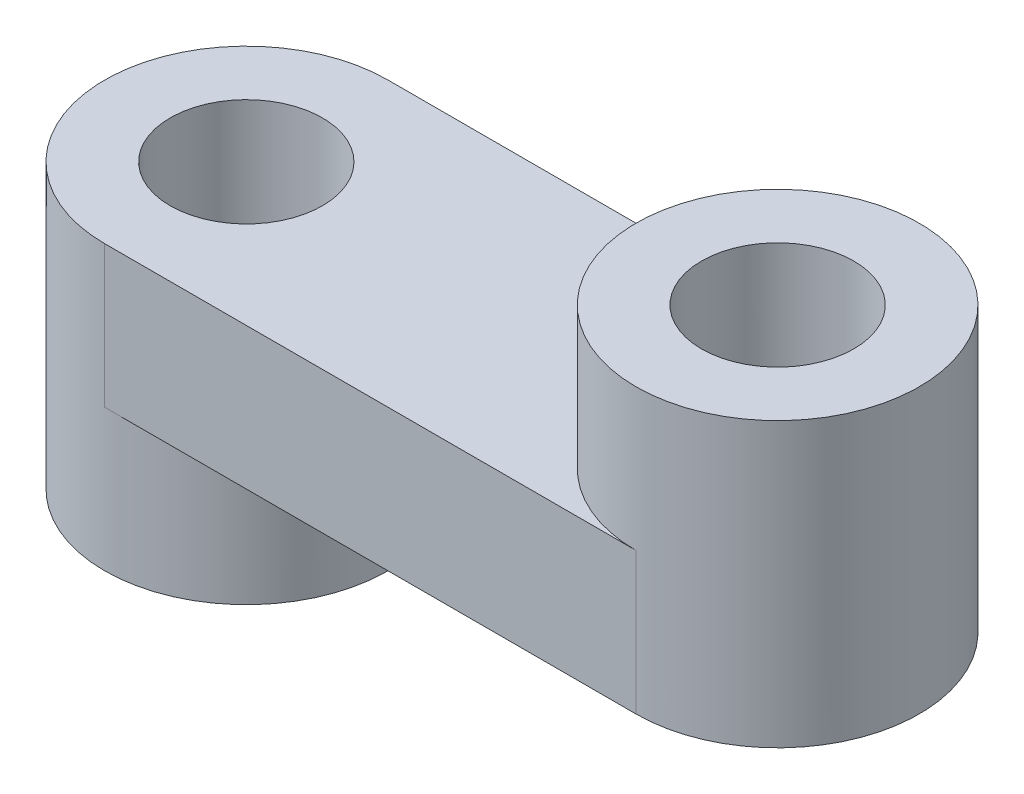
ISO-10303-21;
HEADER;
FILE_DESCRIPTION(('STEP AP214'),'2;1');
FILE_NAME('part.step','',(''),(''),'','','');
FILE_SCHEMA(('AUTOMOTIVE_DESIGN { 1 0 10303 214 1 1 1 1 }'));
ENDSEC;
DATA;
#1=APPLICATION_CONTEXT('core data for automotive mechanical design processes');
#2=APPLICATION_PROTOCOL_DEFINITION('international standard','automotive_design',2000,#1);
#3=PRODUCT_CONTEXT('',#1,'mechanical');
#4=PRODUCT('Part','Part','',(#3));
#5=PRODUCT_RELATED_PRODUCT_CATEGORY('part','',(#4));
#6=PRODUCT_DEFINITION_FORMATION('','',#4);
#7=PRODUCT_DEFINITION_CONTEXT('part definition',#1,'design');
#8=PRODUCT_DEFINITION('design','',#6,#7);
#9=PRODUCT_DEFINITION_SHAPE('','',#8);
#10=(LENGTH_UNIT() NAMED_UNIT(*) SI_UNIT(.MILLI.,.METRE.));
#11=(NAMED_UNIT(*) PLANE_ANGLE_UNIT() SI_UNIT($,.RADIAN.));
#12=(NAMED_UNIT(*) SI_UNIT($,.STERADIAN.) SOLID_ANGLE_UNIT());
#13=UNCERTAINTY_MEASURE_WITH_UNIT(LENGTH_MEASURE(1.E-05),#10,'distance_accuracy_value','');
#14=(GEOMETRIC_REPRESENTATION_CONTEXT(3) GLOBAL_UNCERTAINTY_ASSIGNED_CONTEXT((#13)) GLOBAL_UNIT_ASSIGNED_CONTEXT((#10,
#11,#12)) REPRESENTATION_CONTEXT('',''));
#15=CARTESIAN_POINT('',(0.,0.,0.));
#16=DIRECTION('',(0.,0.,1.));
#17=DIRECTION('',(1.,0.,0.));
#18=AXIS2_PLACEMENT_3D('',#15,#16,#17);
#19=CARTESIAN_POINT('',(0.,6.,2.));
#20=DIRECTION('',(0.,0.,-1.));
#21=DIRECTION('',(-1.,0.,0.));
#22=AXIS2_PLACEMENT_3D('',#19,#20,#21);
#23=PLANE('',#22);
#24=DIRECTION('',(-1.,0.,0.));
#25=VECTOR('',#24,1.);
#26=CARTESIAN_POINT('',(7.5,2.,2.));
#27=LINE('',#26,#25);
#28=CARTESIAN_POINT('',(7.5,2.,2.));
#29=VERTEX_POINT('',#28);
#30=CARTESIAN_POINT('',(0.,2.,2.));
#31=VERTEX_POINT('',#30);
#32=EDGE_CURVE('E88',#29,#31,#27,.T.);
#33=ORIENTED_EDGE('',*,*,#32,.F.);
#34=DIRECTION('',(0.,-1.,0.));
#35=VECTOR('',#34,1.);
#36=CARTESIAN_POINT('',(7.5,6.,2.));
#37=LINE('',#36,#35);
#38=CARTESIAN_POINT('',(7.5,4.,2.));
#39=VERTEX_POINT('',#38);
#40=EDGE_CURVE('E53',#39,#29,#37,.T.);
#41=ORIENTED_EDGE('',*,*,#40,.F.);
#42=DIRECTION('',(-1.,0.,0.));
#43=VECTOR('',#42,1.);
#44=CARTESIAN_POINT('',(7.5,4.,2.));
#45=LINE('',#44,#43);
#46=CARTESIAN_POINT('',(0.,4.,2.));
#47=VERTEX_POINT('',#46);
#48=EDGE_CURVE('E122',#39,#47,#45,.T.);
#49=ORIENTED_EDGE('',*,*,#48,.T.);
#50=DIRECTION('',(0.,-1.,0.));
#51=VECTOR('',#50,1.);
#52=CARTESIAN_POINT('',(0.,6.,2.));
#53=LINE('',#52,#51);
#54=EDGE_CURVE('E11',#47,#31,#53,.T.);
#55=ORIENTED_EDGE('',*,*,#54,.T.);
#56=EDGE_LOOP('',(#33,#41,#49,#55));
#57=FACE_BOUND('',#56,.T.);
#58=ADVANCED_FACE('F43',(#57),#23,.F.);
#59=CARTESIAN_POINT('',(0.,6.,-2.));
#60=DIRECTION('',(0.,0.,1.));
#61=DIRECTION('',(1.,0.,0.));
#62=AXIS2_PLACEMENT_3D('',#59,#60,#61);
#63=PLANE('',#62);
#64=DIRECTION('',(1.,0.,0.));
#65=VECTOR('',#64,1.);
#66=CARTESIAN_POINT('',(0.,2.,-2.));
#67=LINE('',#66,#65);
#68=CARTESIAN_POINT('',(0.,2.,-2.));
#69=VERTEX_POINT('',#68);
#70=CARTESIAN_POINT('',(7.5,2.,-2.));
#71=VERTEX_POINT('',#70);
#72=EDGE_CURVE('E61',#69,#71,#67,.T.);
#73=ORIENTED_EDGE('',*,*,#72,.F.);
#74=DIRECTION('',(0.,-1.,0.));
#75=VECTOR('',#74,1.);
#76=CARTESIAN_POINT('',(0.,6.,-2.));
#77=LINE('',#76,#75);
#78=CARTESIAN_POINT('',(0.,4.,-2.));
#79=VERTEX_POINT('',#78);
#80=EDGE_CURVE('E107',#79,#69,#77,.T.);
#81=ORIENTED_EDGE('',*,*,#80,.F.);
#82=DIRECTION('',(1.,0.,0.));
#83=VECTOR('',#82,1.);
#84=CARTESIAN_POINT('',(0.,4.,-2.));
#85=LINE('',#84,#83);
#86=CARTESIAN_POINT('',(7.5,4.,-2.));
#87=VERTEX_POINT('',#86);
#88=EDGE_CURVE('E145',#79,#87,#85,.T.);
#89=ORIENTED_EDGE('',*,*,#88,.T.);
#90=DIRECTION('',(0.,-1.,0.));
#91=VECTOR('',#90,1.);
#92=CARTESIAN_POINT('',(7.5,6.,-2.));
#93=LINE('',#92,#91);
#94=EDGE_CURVE('E104',#87,#71,#93,.T.);
#95=ORIENTED_EDGE('',*,*,#94,.T.);
#96=EDGE_LOOP('',(#73,#81,#89,#95));
#97=FACE_BOUND('',#96,.T.);
#98=ADVANCED_FACE('F144',(#97),#63,.F.);
#99=CARTESIAN_POINT('',(7.5,6.,0.));
#100=DIRECTION('',(0.,-1.,0.));
#101=DIRECTION('',(0.,0.,-1.));
#102=AXIS2_PLACEMENT_3D('',#99,#100,#101);
#103=CYLINDRICAL_SURFACE('',#102,2.);
#104=CARTESIAN_POINT('',(7.5,6.,0.));
#105=DIRECTION('',(0.,1.,0.));
#106=DIRECTION('',(0.,0.,1.));
#107=AXIS2_PLACEMENT_3D('',#104,#105,#106);
#108=CIRCLE('',#107,2.);
#109=CARTESIAN_POINT('',(7.5,6.,2.));
#110=VERTEX_POINT('',#109);
#111=EDGE_CURVE('E133',#110,#110,#108,.T.);
#112=ORIENTED_EDGE('',*,*,#111,.F.);
#113=EDGE_LOOP('',(#112));
#114=FACE_BOUND('',#113,.T.);
#115=CARTESIAN_POINT('',(7.5,2.,0.));
#116=DIRECTION('',(0.,-1.,0.));
#117=DIRECTION('',(0.,0.,-1.));
#118=AXIS2_PLACEMENT_3D('',#115,#116,#117);
#119=CIRCLE('',#118,2.);
#120=EDGE_CURVE('E85',#71,#29,#119,.T.);
#121=ORIENTED_EDGE('',*,*,#120,.F.);
#122=ORIENTED_EDGE('',*,*,#94,.F.);
#123=CARTESIAN_POINT('',(7.5,4.,0.));
#124=DIRECTION('',(0.,1.,0.));
#125=DIRECTION('',(0.,0.,1.));
#126=AXIS2_PLACEMENT_3D('',#123,#124,#125);
#127=CIRCLE('',#126,2.);
#128=EDGE_CURVE('E69',#87,#39,#127,.T.);
#129=ORIENTED_EDGE('',*,*,#128,.T.);
#130=ORIENTED_EDGE('',*,*,#40,.T.);
#131=EDGE_LOOP('',(#121,#122,#129,#130));
#132=FACE_BOUND('',#131,.T.);
#133=ADVANCED_FACE('F102',(#114,#132),#103,.T.);
#134=CARTESIAN_POINT('',(7.5,6.,0.));
#135=DIRECTION('',(0.,-1.,0.));
#136=DIRECTION('',(0.,0.,-1.));
#137=AXIS2_PLACEMENT_3D('',#134,#135,#136);
#138=CYLINDRICAL_SURFACE('',#137,1.075);
#139=CARTESIAN_POINT('',(7.5,6.,0.));
#140=DIRECTION('',(0.,1.,0.));
#141=DIRECTION('',(0.,0.,1.));
#142=AXIS2_PLACEMENT_3D('',#139,#140,#141);
#143=CIRCLE('',#142,1.075);
#144=CARTESIAN_POINT('',(7.5,6.,1.075));
#145=VERTEX_POINT('',#144);
#146=EDGE_CURVE('E113',#145,#145,#143,.T.);
#147=ORIENTED_EDGE('',*,*,#146,.T.);
#148=EDGE_LOOP('',(#147));
#149=FACE_BOUND('',#148,.T.);
#150=CARTESIAN_POINT('',(7.5,2.,0.));
#151=DIRECTION('',(0.,-1.,0.));
#152=DIRECTION('',(0.,0.,-1.));
#153=AXIS2_PLACEMENT_3D('',#150,#151,#152);
#154=CIRCLE('',#153,1.075);
#155=CARTESIAN_POINT('',(7.5,2.,-1.075));
#156=VERTEX_POINT('',#155);
#157=EDGE_CURVE('E47',#156,#156,#154,.T.);
#158=ORIENTED_EDGE('',*,*,#157,.T.);
#159=EDGE_LOOP('',(#158));
#160=FACE_BOUND('',#159,.T.);
#161=ADVANCED_FACE('F157',(#149,#160),#138,.F.);
#162=CARTESIAN_POINT('',(0.,6.,0.));
#163=DIRECTION('',(0.,1.,0.));
#164=DIRECTION('',(0.,0.,1.));
#165=AXIS2_PLACEMENT_3D('',#162,#163,#164);
#166=PLANE('',#165);
#167=ORIENTED_EDGE('',*,*,#146,.F.);
#168=EDGE_LOOP('',(#167));
#169=FACE_BOUND('',#168,.T.);
#170=ORIENTED_EDGE('',*,*,#111,.T.);
#171=EDGE_LOOP('',(#170));
#172=FACE_BOUND('',#171,.T.);
#173=ADVANCED_FACE('F181',(#169,#172),#166,.T.);
#174=CARTESIAN_POINT('',(0.,6.,0.));
#175=DIRECTION('',(0.,-1.,0.));
#176=DIRECTION('',(0.,0.,-1.));
#177=AXIS2_PLACEMENT_3D('',#174,#175,#176);
#178=CYLINDRICAL_SURFACE('',#177,2.);
#179=CARTESIAN_POINT('',(0.,0.,0.));
#180=DIRECTION('',(0.,1.,0.));
#181=DIRECTION('',(0.,0.,1.));
#182=AXIS2_PLACEMENT_3D('',#179,#180,#181);
#183=CIRCLE('',#182,2.);
#184=CARTESIAN_POINT('',(0.,0.,2.));
#185=VERTEX_POINT('',#184);
#186=EDGE_CURVE('E132',#185,#185,#183,.T.);
#187=ORIENTED_EDGE('',*,*,#186,.T.);
#188=EDGE_LOOP('',(#187));
#189=FACE_BOUND('',#188,.T.);
#190=CARTESIAN_POINT('',(0.,4.,0.));
#191=DIRECTION('',(0.,1.,0.));
#192=DIRECTION('',(0.,0.,1.));
#193=AXIS2_PLACEMENT_3D('',#190,#191,#192);
#194=CIRCLE('',#193,2.);
#195=EDGE_CURVE('E114',#79,#47,#194,.T.);
#196=ORIENTED_EDGE('',*,*,#195,.F.);
#197=ORIENTED_EDGE('',*,*,#80,.T.);
#198=CARTESIAN_POINT('',(0.,2.,0.));
#199=DIRECTION('',(0.,1.,0.));
#200=DIRECTION('',(0.,0.,1.));
#201=AXIS2_PLACEMENT_3D('',#198,#199,#200);
#202=CIRCLE('',#201,2.);
#203=EDGE_CURVE('E100',#31,#69,#202,.T.);
#204=ORIENTED_EDGE('',*,*,#203,.F.);
#205=ORIENTED_EDGE('',*,*,#54,.F.);
#206=EDGE_LOOP('',(#196,#197,#204,#205));
#207=FACE_BOUND('',#206,.T.);
#208=ADVANCED_FACE('F45',(#189,#207),#178,.T.);
#209=CARTESIAN_POINT('',(0.,6.,0.));
#210=DIRECTION('',(0.,-1.,0.));
#211=DIRECTION('',(0.,0.,-1.));
#212=AXIS2_PLACEMENT_3D('',#209,#210,#211);
#213=CYLINDRICAL_SURFACE('',#212,1.075);
#214=CARTESIAN_POINT('',(0.,0.,0.));
#215=DIRECTION('',(0.,1.,0.));
#216=DIRECTION('',(0.,0.,1.));
#217=AXIS2_PLACEMENT_3D('',#214,#215,#216);
#218=CIRCLE('',#217,1.075);
#219=CARTESIAN_POINT('',(0.,0.,1.075));
#220=VERTEX_POINT('',#219);
#221=EDGE_CURVE('E120',#220,#220,#218,.T.);
#222=ORIENTED_EDGE('',*,*,#221,.F.);
#223=EDGE_LOOP('',(#222));
#224=FACE_BOUND('',#223,.T.);
#225=CARTESIAN_POINT('',(0.,4.,0.));
#226=DIRECTION('',(0.,1.,0.));
#227=DIRECTION('',(0.,0.,1.));
#228=AXIS2_PLACEMENT_3D('',#225,#226,#227);
#229=CIRCLE('',#228,1.075);
#230=CARTESIAN_POINT('',(0.,4.,1.075));
#231=VERTEX_POINT('',#230);
#232=EDGE_CURVE('E110',#231,#231,#229,.T.);
#233=ORIENTED_EDGE('',*,*,#232,.T.);
#234=EDGE_LOOP('',(#233));
#235=FACE_BOUND('',#234,.T.);
#236=ADVANCED_FACE('F179',(#224,#235),#213,.F.);
#237=CARTESIAN_POINT('',(0.,0.,0.));
#238=DIRECTION('',(0.,1.,0.));
#239=DIRECTION('',(0.,0.,1.));
#240=AXIS2_PLACEMENT_3D('',#237,#238,#239);
#241=PLANE('',#240);
#242=ORIENTED_EDGE('',*,*,#186,.F.);
#243=EDGE_LOOP('',(#242));
#244=FACE_BOUND('',#243,.T.);
#245=ORIENTED_EDGE('',*,*,#221,.T.);
#246=EDGE_LOOP('',(#245));
#247=FACE_BOUND('',#246,.T.);
#248=ADVANCED_FACE('F165',(#244,#247),#241,.F.);
#249=CARTESIAN_POINT('',(7.5,4.,0.));
#250=DIRECTION('',(0.,1.,0.));
#251=DIRECTION('',(0.,0.,1.));
#252=AXIS2_PLACEMENT_3D('',#249,#250,#251);
#253=PLANE('',#252);
#254=ORIENTED_EDGE('',*,*,#232,.F.);
#255=EDGE_LOOP('',(#254));
#256=FACE_BOUND('',#255,.T.);
#257=ORIENTED_EDGE('',*,*,#88,.F.);
#258=ORIENTED_EDGE('',*,*,#195,.T.);
#259=ORIENTED_EDGE('',*,*,#48,.F.);
#260=ORIENTED_EDGE('',*,*,#128,.F.);
#261=EDGE_LOOP('',(#257,#258,#259,#260));
#262=FACE_BOUND('',#261,.T.);
#263=ADVANCED_FACE('F160',(#256,#262),#253,.T.);
#264=CARTESIAN_POINT('',(7.5,2.,0.));
#265=DIRECTION('',(0.,-1.,0.));
#266=DIRECTION('',(0.,0.,-1.));
#267=AXIS2_PLACEMENT_3D('',#264,#265,#266);
#268=PLANE('',#267);
#269=ORIENTED_EDGE('',*,*,#157,.F.);
#270=EDGE_LOOP('',(#269));
#271=FACE_BOUND('',#270,.T.);
#272=ORIENTED_EDGE('',*,*,#120,.T.);
#273=ORIENTED_EDGE('',*,*,#32,.T.);
#274=ORIENTED_EDGE('',*,*,#203,.T.);
#275=ORIENTED_EDGE('',*,*,#72,.T.);
#276=EDGE_LOOP('',(#272,#273,#274,#275));
#277=FACE_BOUND('',#276,.T.);
#278=ADVANCED_FACE('F87',(#271,#277),#268,.T.);
#279=CLOSED_SHELL('',(#58,#98,#133,#161,#173,#208,#236,#248,#263,#278));
#280=MANIFOLD_SOLID_BREP('B2',#279);
#281=ADVANCED_BREP_SHAPE_REPRESENTATION('',(#18,#280),#14);
#282=SHAPE_DEFINITION_REPRESENTATION(#9,#281);
ENDSEC;
END-ISO-10303-21;
